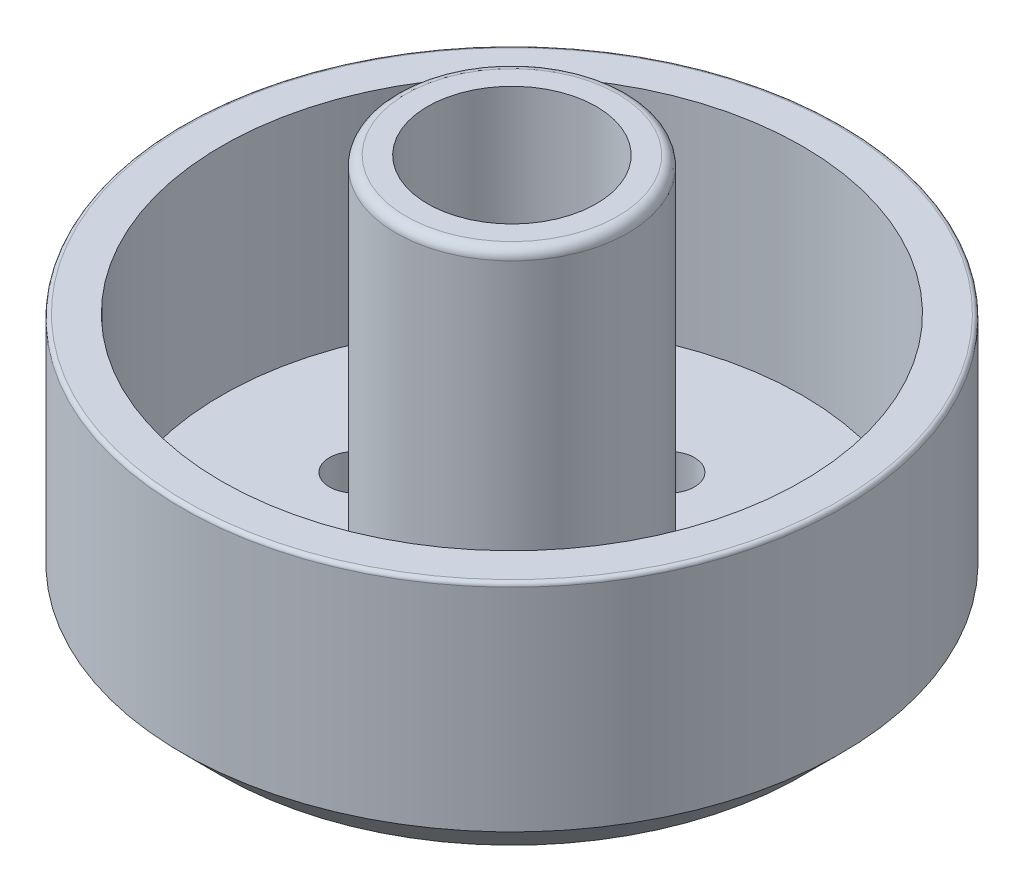
ISO-10303-21;
HEADER;
FILE_DESCRIPTION(('STEP AP214'),'2;1');
FILE_NAME('part.step','',(''),(''),'','','');
FILE_SCHEMA(('AUTOMOTIVE_DESIGN { 1 0 10303 214 1 1 1 1 }'));
ENDSEC;
DATA;
#1=APPLICATION_CONTEXT('core data for automotive mechanical design processes');
#2=APPLICATION_PROTOCOL_DEFINITION('international standard','automotive_design',2000,#1);
#3=PRODUCT_CONTEXT('',#1,'mechanical');
#4=PRODUCT('Part','Part','',(#3));
#5=PRODUCT_RELATED_PRODUCT_CATEGORY('part','',(#4));
#6=PRODUCT_DEFINITION_FORMATION('','',#4);
#7=PRODUCT_DEFINITION_CONTEXT('part definition',#1,'design');
#8=PRODUCT_DEFINITION('design','',#6,#7);
#9=PRODUCT_DEFINITION_SHAPE('','',#8);
#10=(LENGTH_UNIT() NAMED_UNIT(*) SI_UNIT(.MILLI.,.METRE.));
#11=(NAMED_UNIT(*) PLANE_ANGLE_UNIT() SI_UNIT($,.RADIAN.));
#12=(NAMED_UNIT(*) SI_UNIT($,.STERADIAN.) SOLID_ANGLE_UNIT());
#13=UNCERTAINTY_MEASURE_WITH_UNIT(LENGTH_MEASURE(1.E-05),#10,'distance_accuracy_value','');
#14=(GEOMETRIC_REPRESENTATION_CONTEXT(3) GLOBAL_UNCERTAINTY_ASSIGNED_CONTEXT((#13)) GLOBAL_UNIT_ASSIGNED_CONTEXT((#10,
#11,#12)) REPRESENTATION_CONTEXT('',''));
#15=CARTESIAN_POINT('',(0.,0.,0.));
#16=DIRECTION('',(0.,0.,1.));
#17=DIRECTION('',(1.,0.,0.));
#18=AXIS2_PLACEMENT_3D('',#15,#16,#17);
#19=CARTESIAN_POINT('',(0.,0.,0.));
#20=DIRECTION('',(0.,1.,0.));
#21=DIRECTION('',(0.,0.,-1.));
#22=AXIS2_PLACEMENT_3D('',#19,#20,#21);
#23=PLANE('',#22);
#24=CARTESIAN_POINT('',(-7.99999999999977,0.,-2.26883816723573E-13));
#25=DIRECTION('',(0.,-1.,0.));
#26=DIRECTION('',(0.,0.,-1.));
#27=AXIS2_PLACEMENT_3D('',#24,#25,#26);
#28=CIRCLE('',#27,1.30000000000036);
#29=CARTESIAN_POINT('',(-7.99999999999977,0.,-1.30000000000059));
#30=VERTEX_POINT('',#29);
#31=EDGE_CURVE('E78',#30,#30,#28,.T.);
#32=ORIENTED_EDGE('',*,*,#31,.F.);
#33=EDGE_LOOP('',(#32));
#34=FACE_BOUND('',#33,.T.);
#35=CARTESIAN_POINT('',(4.51808198568511E-13,0.,-8.));
#36=DIRECTION('',(0.,-1.,0.));
#37=DIRECTION('',(0.,0.,-1.));
#38=AXIS2_PLACEMENT_3D('',#35,#36,#37);
#39=CIRCLE('',#38,1.30000000000049);
#40=CARTESIAN_POINT('',(4.51808198568511E-13,0.,-9.30000000000049));
#41=VERTEX_POINT('',#40);
#42=EDGE_CURVE('E75',#41,#41,#39,.T.);
#43=ORIENTED_EDGE('',*,*,#42,.F.);
#44=EDGE_LOOP('',(#43));
#45=FACE_BOUND('',#44,.T.);
#46=CARTESIAN_POINT('',(8.,0.,0.));
#47=DIRECTION('',(0.,-1.,0.));
#48=DIRECTION('',(0.,0.,-1.));
#49=AXIS2_PLACEMENT_3D('',#46,#47,#48);
#50=CIRCLE('',#49,1.3);
#51=CARTESIAN_POINT('',(8.,0.,-1.30000000000003));
#52=VERTEX_POINT('',#51);
#53=EDGE_CURVE('E72',#52,#52,#50,.T.);
#54=ORIENTED_EDGE('',*,*,#53,.F.);
#55=EDGE_LOOP('',(#54));
#56=FACE_BOUND('',#55,.T.);
#57=CARTESIAN_POINT('',(0.,0.,0.));
#58=DIRECTION('',(0.,-1.,0.));
#59=DIRECTION('',(0.,0.,-1.));
#60=AXIS2_PLACEMENT_3D('',#57,#58,#59);
#61=CIRCLE('',#60,4.3);
#62=CARTESIAN_POINT('',(0.,0.,-4.3));
#63=VERTEX_POINT('',#62);
#64=EDGE_CURVE('E69',#63,#63,#61,.T.);
#65=ORIENTED_EDGE('',*,*,#64,.F.);
#66=EDGE_LOOP('',(#65));
#67=FACE_BOUND('',#66,.T.);
#68=CARTESIAN_POINT('',(0.,0.,8.));
#69=DIRECTION('',(0.,-1.,0.));
#70=DIRECTION('',(0.,0.,-1.));
#71=AXIS2_PLACEMENT_3D('',#68,#69,#70);
#72=CIRCLE('',#71,1.3);
#73=CARTESIAN_POINT('',(0.,0.,6.7));
#74=VERTEX_POINT('',#73);
#75=EDGE_CURVE('E61',#74,#74,#72,.T.);
#76=ORIENTED_EDGE('',*,*,#75,.F.);
#77=EDGE_LOOP('',(#76));
#78=FACE_BOUND('',#77,.T.);
#79=CARTESIAN_POINT('',(0.,0.,0.));
#80=DIRECTION('',(0.,-1.,0.));
#81=DIRECTION('',(0.,0.,-1.));
#82=AXIS2_PLACEMENT_3D('',#79,#80,#81);
#83=CIRCLE('',#82,14.8);
#84=CARTESIAN_POINT('',(0.,0.,-14.8));
#85=VERTEX_POINT('',#84);
#86=EDGE_CURVE('E100',#85,#85,#83,.T.);
#87=ORIENTED_EDGE('',*,*,#86,.T.);
#88=EDGE_LOOP('',(#87));
#89=FACE_BOUND('',#88,.T.);
#90=ADVANCED_FACE('F41',(#34,#45,#56,#67,#78,#89),#23,.F.);
#91=CARTESIAN_POINT('',(0.,2.,0.));
#92=DIRECTION('',(0.,1.,0.));
#93=DIRECTION('',(0.,0.,-1.));
#94=AXIS2_PLACEMENT_3D('',#91,#92,#93);
#95=PLANE('',#94);
#96=CARTESIAN_POINT('',(0.,2.,0.));
#97=DIRECTION('',(0.,-1.,0.));
#98=DIRECTION('',(0.,0.,-1.));
#99=AXIS2_PLACEMENT_3D('',#96,#97,#98);
#100=CIRCLE('',#99,14.8);
#101=CARTESIAN_POINT('',(0.,2.,-14.8));
#102=VERTEX_POINT('',#101);
#103=EDGE_CURVE('E66',#102,#102,#100,.F.);
#104=ORIENTED_EDGE('',*,*,#103,.T.);
#105=EDGE_LOOP('',(#104));
#106=FACE_BOUND('',#105,.T.);
#107=CARTESIAN_POINT('',(-7.99999999999977,2.,-2.26883816723573E-13));
#108=DIRECTION('',(0.,-1.,0.));
#109=DIRECTION('',(0.,0.,-1.));
#110=AXIS2_PLACEMENT_3D('',#107,#108,#109);
#111=CIRCLE('',#110,1.30000000000036);
#112=CARTESIAN_POINT('',(-7.99999999999977,2.,-1.30000000000059));
#113=VERTEX_POINT('',#112);
#114=EDGE_CURVE('E62',#113,#113,#111,.T.);
#115=ORIENTED_EDGE('',*,*,#114,.T.);
#116=EDGE_LOOP('',(#115));
#117=FACE_BOUND('',#116,.T.);
#118=CARTESIAN_POINT('',(4.51808198568511E-13,2.,-8.));
#119=DIRECTION('',(0.,-1.,0.));
#120=DIRECTION('',(0.,0.,-1.));
#121=AXIS2_PLACEMENT_3D('',#118,#119,#120);
#122=CIRCLE('',#121,1.30000000000049);
#123=CARTESIAN_POINT('',(4.51808198568511E-13,2.,-9.30000000000049));
#124=VERTEX_POINT('',#123);
#125=EDGE_CURVE('E65',#124,#124,#122,.T.);
#126=ORIENTED_EDGE('',*,*,#125,.T.);
#127=EDGE_LOOP('',(#126));
#128=FACE_BOUND('',#127,.T.);
#129=CARTESIAN_POINT('',(8.,2.,0.));
#130=DIRECTION('',(0.,-1.,0.));
#131=DIRECTION('',(0.,0.,-1.));
#132=AXIS2_PLACEMENT_3D('',#129,#130,#131);
#133=CIRCLE('',#132,1.3);
#134=CARTESIAN_POINT('',(8.,2.,-1.30000000000003));
#135=VERTEX_POINT('',#134);
#136=EDGE_CURVE('E84',#135,#135,#133,.T.);
#137=ORIENTED_EDGE('',*,*,#136,.T.);
#138=EDGE_LOOP('',(#137));
#139=FACE_BOUND('',#138,.T.);
#140=CARTESIAN_POINT('',(0.,2.,8.));
#141=DIRECTION('',(0.,-1.,0.));
#142=DIRECTION('',(0.,0.,-1.));
#143=AXIS2_PLACEMENT_3D('',#140,#141,#142);
#144=CIRCLE('',#143,1.3);
#145=CARTESIAN_POINT('',(0.,2.,6.7));
#146=VERTEX_POINT('',#145);
#147=EDGE_CURVE('E81',#146,#146,#144,.T.);
#148=ORIENTED_EDGE('',*,*,#147,.T.);
#149=EDGE_LOOP('',(#148));
#150=FACE_BOUND('',#149,.T.);
#151=CARTESIAN_POINT('',(0.,2.,0.));
#152=DIRECTION('',(0.,-1.,0.));
#153=DIRECTION('',(0.,0.,-1.));
#154=AXIS2_PLACEMENT_3D('',#151,#152,#153);
#155=CIRCLE('',#154,5.9);
#156=CARTESIAN_POINT('',(0.,2.,-5.9));
#157=VERTEX_POINT('',#156);
#158=EDGE_CURVE('E94',#157,#157,#155,.T.);
#159=ORIENTED_EDGE('',*,*,#158,.T.);
#160=EDGE_LOOP('',(#159));
#161=FACE_BOUND('',#160,.T.);
#162=ADVANCED_FACE('F139',(#106,#117,#128,#139,#150,#161),#95,.T.);
#163=CARTESIAN_POINT('',(0.,13.,8.));
#164=DIRECTION('',(0.,-1.,0.));
#165=DIRECTION('',(0.,0.,1.));
#166=AXIS2_PLACEMENT_3D('',#163,#164,#165);
#167=CYLINDRICAL_SURFACE('',#166,1.3);
#168=ORIENTED_EDGE('',*,*,#75,.T.);
#169=EDGE_LOOP('',(#168));
#170=FACE_BOUND('',#169,.T.);
#171=ORIENTED_EDGE('',*,*,#147,.F.);
#172=EDGE_LOOP('',(#171));
#173=FACE_BOUND('',#172,.T.);
#174=ADVANCED_FACE('F145',(#170,#173),#167,.F.);
#175=CARTESIAN_POINT('',(0.,13.,0.));
#176=DIRECTION('',(0.,-1.,0.));
#177=DIRECTION('',(0.,0.,1.));
#178=AXIS2_PLACEMENT_3D('',#175,#176,#177);
#179=CYLINDRICAL_SURFACE('',#178,4.3);
#180=ORIENTED_EDGE('',*,*,#64,.T.);
#181=EDGE_LOOP('',(#180));
#182=FACE_BOUND('',#181,.T.);
#183=CARTESIAN_POINT('',(0.,20.,0.));
#184=DIRECTION('',(0.,-1.,0.));
#185=DIRECTION('',(0.,0.,-1.));
#186=AXIS2_PLACEMENT_3D('',#183,#184,#185);
#187=CIRCLE('',#186,4.3);
#188=CARTESIAN_POINT('',(0.,20.,-4.3));
#189=VERTEX_POINT('',#188);
#190=EDGE_CURVE('E97',#189,#189,#187,.T.);
#191=ORIENTED_EDGE('',*,*,#190,.F.);
#192=EDGE_LOOP('',(#191));
#193=FACE_BOUND('',#192,.T.);
#194=ADVANCED_FACE('F152',(#182,#193),#179,.F.);
#195=CARTESIAN_POINT('',(8.,13.,0.));
#196=DIRECTION('',(0.,-1.,0.));
#197=DIRECTION('',(0.,0.,1.));
#198=AXIS2_PLACEMENT_3D('',#195,#196,#197);
#199=CYLINDRICAL_SURFACE('',#198,1.3);
#200=ORIENTED_EDGE('',*,*,#53,.T.);
#201=EDGE_LOOP('',(#200));
#202=FACE_BOUND('',#201,.T.);
#203=ORIENTED_EDGE('',*,*,#136,.F.);
#204=EDGE_LOOP('',(#203));
#205=FACE_BOUND('',#204,.T.);
#206=ADVANCED_FACE('F156',(#202,#205),#199,.F.);
#207=CARTESIAN_POINT('',(4.51808198568511E-13,13.,-8.));
#208=DIRECTION('',(0.,-1.,0.));
#209=DIRECTION('',(0.,0.,1.));
#210=AXIS2_PLACEMENT_3D('',#207,#208,#209);
#211=CYLINDRICAL_SURFACE('',#210,1.30000000000049);
#212=ORIENTED_EDGE('',*,*,#42,.T.);
#213=EDGE_LOOP('',(#212));
#214=FACE_BOUND('',#213,.T.);
#215=ORIENTED_EDGE('',*,*,#125,.F.);
#216=EDGE_LOOP('',(#215));
#217=FACE_BOUND('',#216,.T.);
#218=ADVANCED_FACE('F160',(#214,#217),#211,.F.);
#219=CARTESIAN_POINT('',(-7.99999999999977,13.,-2.26883816723573E-13));
#220=DIRECTION('',(0.,-1.,0.));
#221=DIRECTION('',(0.,0.,1.));
#222=AXIS2_PLACEMENT_3D('',#219,#220,#221);
#223=CYLINDRICAL_SURFACE('',#222,1.30000000000036);
#224=ORIENTED_EDGE('',*,*,#31,.T.);
#225=EDGE_LOOP('',(#224));
#226=FACE_BOUND('',#225,.T.);
#227=ORIENTED_EDGE('',*,*,#114,.F.);
#228=EDGE_LOOP('',(#227));
#229=FACE_BOUND('',#228,.T.);
#230=ADVANCED_FACE('F126',(#226,#229),#223,.F.);
#231=CARTESIAN_POINT('',(0.,13.,0.));
#232=DIRECTION('',(0.,1.,0.));
#233=DIRECTION('',(0.,0.,-1.));
#234=AXIS2_PLACEMENT_3D('',#231,#232,#233);
#235=PLANE('',#234);
#236=CARTESIAN_POINT('',(0.,13.,0.));
#237=DIRECTION('',(0.,-1.,0.));
#238=DIRECTION('',(0.,0.,-1.));
#239=AXIS2_PLACEMENT_3D('',#236,#237,#238);
#240=CIRCLE('',#239,16.6);
#241=CARTESIAN_POINT('',(0.,13.,-16.6));
#242=VERTEX_POINT('',#241);
#243=EDGE_CURVE('E56',#242,#242,#240,.T.);
#244=ORIENTED_EDGE('',*,*,#243,.F.);
#245=EDGE_LOOP('',(#244));
#246=FACE_BOUND('',#245,.T.);
#247=CARTESIAN_POINT('',(0.,13.,0.));
#248=DIRECTION('',(0.,-1.,0.));
#249=DIRECTION('',(0.,0.,-1.));
#250=AXIS2_PLACEMENT_3D('',#247,#248,#249);
#251=CIRCLE('',#250,14.8);
#252=CARTESIAN_POINT('',(0.,13.,-14.8));
#253=VERTEX_POINT('',#252);
#254=EDGE_CURVE('E91',#253,#253,#251,.T.);
#255=ORIENTED_EDGE('',*,*,#254,.T.);
#256=EDGE_LOOP('',(#255));
#257=FACE_BOUND('',#256,.T.);
#258=ADVANCED_FACE('F114',(#246,#257),#235,.T.);
#259=CARTESIAN_POINT('',(0.,13.,0.));
#260=DIRECTION('',(0.,-1.,0.));
#261=DIRECTION('',(0.,0.,1.));
#262=AXIS2_PLACEMENT_3D('',#259,#260,#261);
#263=CYLINDRICAL_SURFACE('',#262,16.8);
#264=CARTESIAN_POINT('',(0.,1.99999999999995,0.));
#265=DIRECTION('',(0.,-1.,0.));
#266=DIRECTION('',(0.,0.,-1.));
#267=AXIS2_PLACEMENT_3D('',#264,#265,#266);
#268=CIRCLE('',#267,16.8);
#269=CARTESIAN_POINT('',(0.,1.99999999999995,-16.8));
#270=VERTEX_POINT('',#269);
#271=EDGE_CURVE('E103',#270,#270,#268,.T.);
#272=ORIENTED_EDGE('',*,*,#271,.F.);
#273=EDGE_LOOP('',(#272));
#274=FACE_BOUND('',#273,.T.);
#275=CARTESIAN_POINT('',(0.,12.8,0.));
#276=DIRECTION('',(0.,-1.,0.));
#277=DIRECTION('',(0.,0.,-1.));
#278=AXIS2_PLACEMENT_3D('',#275,#276,#277);
#279=CIRCLE('',#278,16.8);
#280=CARTESIAN_POINT('',(0.,12.8,-16.8));
#281=VERTEX_POINT('',#280);
#282=EDGE_CURVE('E52',#281,#281,#279,.F.);
#283=ORIENTED_EDGE('',*,*,#282,.F.);
#284=EDGE_LOOP('',(#283));
#285=FACE_BOUND('',#284,.T.);
#286=ADVANCED_FACE('F110',(#274,#285),#263,.T.);
#287=CARTESIAN_POINT('',(0.,-41.8607214462436,0.));
#288=DIRECTION('',(0.,1.,0.));
#289=DIRECTION('',(0.,0.,-1.));
#290=AXIS2_PLACEMENT_3D('',#287,#288,#289);
#291=CYLINDRICAL_SURFACE('',#290,14.8);
#292=ORIENTED_EDGE('',*,*,#103,.F.);
#293=EDGE_LOOP('',(#292));
#294=FACE_BOUND('',#293,.T.);
#295=ORIENTED_EDGE('',*,*,#254,.F.);
#296=EDGE_LOOP('',(#295));
#297=FACE_BOUND('',#296,.T.);
#298=ADVANCED_FACE('F113',(#294,#297),#291,.F.);
#299=CARTESIAN_POINT('',(0.,12.8,0.));
#300=DIRECTION('',(0.,1.,0.));
#301=DIRECTION('',(0.,0.,-1.));
#302=AXIS2_PLACEMENT_3D('',#299,#300,#301);
#303=TOROIDAL_SURFACE('',#302,16.6,0.2);
#304=ORIENTED_EDGE('',*,*,#282,.T.);
#305=EDGE_LOOP('',(#304));
#306=FACE_BOUND('',#305,.T.);
#307=ORIENTED_EDGE('',*,*,#243,.T.);
#308=EDGE_LOOP('',(#307));
#309=FACE_BOUND('',#308,.T.);
#310=ADVANCED_FACE('F118',(#306,#309),#303,.T.);
#311=CARTESIAN_POINT('',(0.,20.,0.));
#312=DIRECTION('',(0.,1.,0.));
#313=DIRECTION('',(0.,0.,-1.));
#314=AXIS2_PLACEMENT_3D('',#311,#312,#313);
#315=PLANE('',#314);
#316=CARTESIAN_POINT('',(0.,20.,0.));
#317=DIRECTION('',(0.,-1.,0.));
#318=DIRECTION('',(0.,0.,-1.));
#319=AXIS2_PLACEMENT_3D('',#316,#317,#318);
#320=CIRCLE('',#319,5.4);
#321=CARTESIAN_POINT('',(0.,20.,-5.4));
#322=VERTEX_POINT('',#321);
#323=EDGE_CURVE('E48',#322,#322,#320,.T.);
#324=ORIENTED_EDGE('',*,*,#323,.F.);
#325=EDGE_LOOP('',(#324));
#326=FACE_BOUND('',#325,.T.);
#327=ORIENTED_EDGE('',*,*,#190,.T.);
#328=EDGE_LOOP('',(#327));
#329=FACE_BOUND('',#328,.T.);
#330=ADVANCED_FACE('F121',(#326,#329),#315,.T.);
#331=CARTESIAN_POINT('',(0.,20.,0.));
#332=DIRECTION('',(0.,-1.,0.));
#333=DIRECTION('',(0.,0.,1.));
#334=AXIS2_PLACEMENT_3D('',#331,#332,#333);
#335=CYLINDRICAL_SURFACE('',#334,5.9);
#336=CARTESIAN_POINT('',(0.,19.5,0.));
#337=DIRECTION('',(0.,-1.,0.));
#338=DIRECTION('',(0.,0.,-1.));
#339=AXIS2_PLACEMENT_3D('',#336,#337,#338);
#340=CIRCLE('',#339,5.9);
#341=CARTESIAN_POINT('',(0.,19.5,-5.9));
#342=VERTEX_POINT('',#341);
#343=EDGE_CURVE('E11',#342,#342,#340,.F.);
#344=ORIENTED_EDGE('',*,*,#343,.F.);
#345=EDGE_LOOP('',(#344));
#346=FACE_BOUND('',#345,.T.);
#347=ORIENTED_EDGE('',*,*,#158,.F.);
#348=EDGE_LOOP('',(#347));
#349=FACE_BOUND('',#348,.T.);
#350=ADVANCED_FACE('F180',(#346,#349),#335,.T.);
#351=CARTESIAN_POINT('',(0.,19.5,0.));
#352=DIRECTION('',(0.,1.,0.));
#353=DIRECTION('',(0.,0.,-1.));
#354=AXIS2_PLACEMENT_3D('',#351,#352,#353);
#355=TOROIDAL_SURFACE('',#354,5.4,0.5);
#356=ORIENTED_EDGE('',*,*,#343,.T.);
#357=EDGE_LOOP('',(#356));
#358=FACE_BOUND('',#357,.T.);
#359=ORIENTED_EDGE('',*,*,#323,.T.);
#360=EDGE_LOOP('',(#359));
#361=FACE_BOUND('',#360,.T.);
#362=ADVANCED_FACE('F43',(#358,#361),#355,.T.);
#363=CARTESIAN_POINT('',(0.,0.,0.));
#364=DIRECTION('',(0.,1.,0.));
#365=DIRECTION('',(0.,0.,-1.));
#366=AXIS2_PLACEMENT_3D('',#363,#364,#365);
#367=CONICAL_SURFACE('',#366,14.8,0.78539816339746);
#368=ORIENTED_EDGE('',*,*,#271,.T.);
#369=EDGE_LOOP('',(#368));
#370=FACE_BOUND('',#369,.T.);
#371=ORIENTED_EDGE('',*,*,#86,.F.);
#372=EDGE_LOOP('',(#371));
#373=FACE_BOUND('',#372,.T.);
#374=ADVANCED_FACE('F107',(#370,#373),#367,.T.);
#375=CLOSED_SHELL('',(#90,#162,#174,#194,#206,#218,#230,#258,#286,#298,#310,#330,#350,#362,#374));
#376=MANIFOLD_SOLID_BREP('B2',#375);
#377=ADVANCED_BREP_SHAPE_REPRESENTATION('',(#18,#376),#14);
#378=SHAPE_DEFINITION_REPRESENTATION(#9,#377);
ENDSEC;
END-ISO-10303-21;
